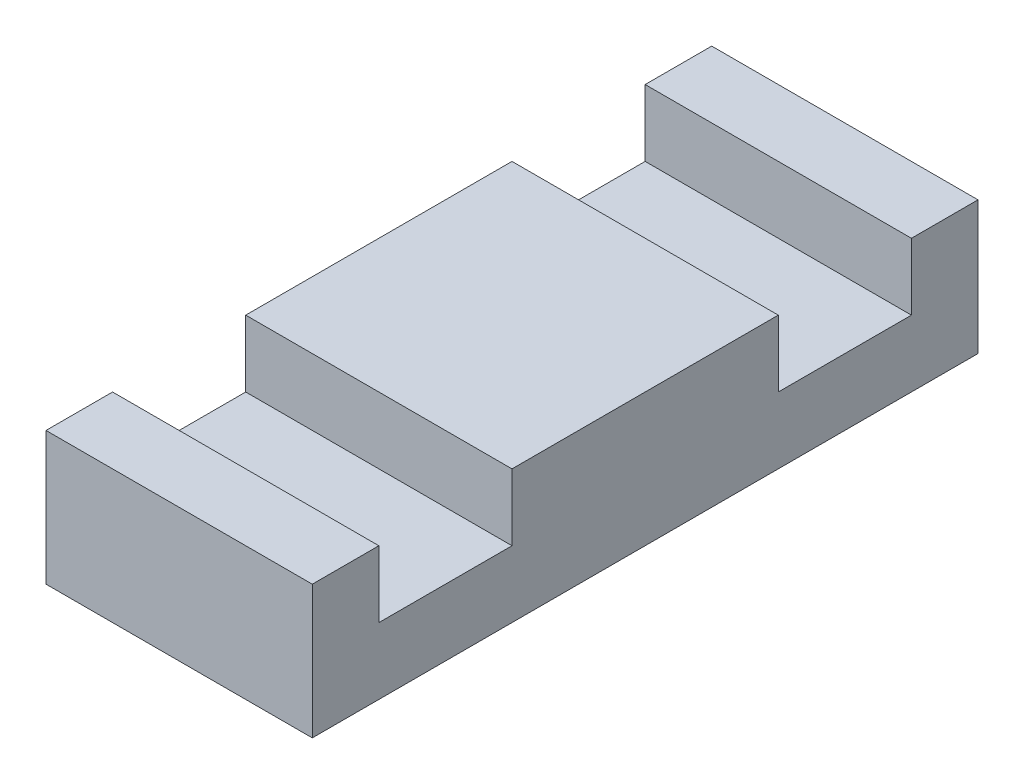
ISO-10303-21;
HEADER;
FILE_DESCRIPTION(('STEP AP214'),'2;1');
FILE_NAME('part.step','',(''),(''),'','','');
FILE_SCHEMA(('AUTOMOTIVE_DESIGN { 1 0 10303 214 1 1 1 1 }'));
ENDSEC;
DATA;
#1=APPLICATION_CONTEXT('core data for automotive mechanical design processes');
#2=APPLICATION_PROTOCOL_DEFINITION('international standard','automotive_design',2000,#1);
#3=PRODUCT_CONTEXT('',#1,'mechanical');
#4=PRODUCT('Part','Part','',(#3));
#5=PRODUCT_RELATED_PRODUCT_CATEGORY('part','',(#4));
#6=PRODUCT_DEFINITION_FORMATION('','',#4);
#7=PRODUCT_DEFINITION_CONTEXT('part definition',#1,'design');
#8=PRODUCT_DEFINITION('design','',#6,#7);
#9=PRODUCT_DEFINITION_SHAPE('','',#8);
#10=(LENGTH_UNIT() NAMED_UNIT(*) SI_UNIT(.MILLI.,.METRE.));
#11=(NAMED_UNIT(*) PLANE_ANGLE_UNIT() SI_UNIT($,.RADIAN.));
#12=(NAMED_UNIT(*) SI_UNIT($,.STERADIAN.) SOLID_ANGLE_UNIT());
#13=UNCERTAINTY_MEASURE_WITH_UNIT(LENGTH_MEASURE(1.E-05),#10,'distance_accuracy_value','');
#14=(GEOMETRIC_REPRESENTATION_CONTEXT(3) GLOBAL_UNCERTAINTY_ASSIGNED_CONTEXT((#13)) GLOBAL_UNIT_ASSIGNED_CONTEXT((#10,
#11,#12)) REPRESENTATION_CONTEXT('',''));
#15=CARTESIAN_POINT('',(0.,0.,0.));
#16=DIRECTION('',(0.,0.,1.));
#17=DIRECTION('',(1.,0.,0.));
#18=AXIS2_PLACEMENT_3D('',#15,#16,#17);
#19=CARTESIAN_POINT('',(0.,12.7,0.));
#20=DIRECTION('',(0.,-1.,0.));
#21=DIRECTION('',(0.,0.,-1.));
#22=AXIS2_PLACEMENT_3D('',#19,#20,#21);
#23=PLANE('',#22);
#24=DIRECTION('',(0.,0.,1.));
#25=VECTOR('',#24,1.);
#26=CARTESIAN_POINT('',(-12.7,12.7,31.75));
#27=LINE('',#26,#25);
#28=CARTESIAN_POINT('',(-12.7,12.7,-12.7));
#29=VERTEX_POINT('',#28);
#30=CARTESIAN_POINT('',(-12.7,12.7,12.7));
#31=VERTEX_POINT('',#30);
#32=EDGE_CURVE('E187',#29,#31,#27,.T.);
#33=ORIENTED_EDGE('',*,*,#32,.T.);
#34=DIRECTION('',(-1.,0.,0.));
#35=VECTOR('',#34,1.);
#36=CARTESIAN_POINT('',(-12.7,12.7,12.7));
#37=LINE('',#36,#35);
#38=CARTESIAN_POINT('',(12.7,12.7,12.7));
#39=VERTEX_POINT('',#38);
#40=EDGE_CURVE('E138',#39,#31,#37,.T.);
#41=ORIENTED_EDGE('',*,*,#40,.F.);
#42=DIRECTION('',(0.,0.,-1.));
#43=VECTOR('',#42,1.);
#44=CARTESIAN_POINT('',(12.7,12.7,31.75));
#45=LINE('',#44,#43);
#46=CARTESIAN_POINT('',(12.7,12.7,-12.7));
#47=VERTEX_POINT('',#46);
#48=EDGE_CURVE('E180',#39,#47,#45,.T.);
#49=ORIENTED_EDGE('',*,*,#48,.T.);
#50=DIRECTION('',(1.,0.,0.));
#51=VECTOR('',#50,1.);
#52=CARTESIAN_POINT('',(-12.7,12.7,-12.7));
#53=LINE('',#52,#51);
#54=EDGE_CURVE('E162',#29,#47,#53,.T.);
#55=ORIENTED_EDGE('',*,*,#54,.F.);
#56=EDGE_LOOP('',(#33,#41,#49,#55));
#57=FACE_BOUND('',#56,.T.);
#58=ADVANCED_FACE('F33',(#57),#23,.F.);
#59=CARTESIAN_POINT('',(-12.7,12.7,-31.75));
#60=VERTEX_POINT('',#59);
#61=CARTESIAN_POINT('',(-12.7,12.7,-25.4));
#62=VERTEX_POINT('',#61);
#63=EDGE_CURVE('E183',#60,#62,#27,.T.);
#64=ORIENTED_EDGE('',*,*,#63,.T.);
#65=DIRECTION('',(-1.,0.,0.));
#66=VECTOR('',#65,1.);
#67=CARTESIAN_POINT('',(-12.7,12.7,-25.4));
#68=LINE('',#67,#66);
#69=CARTESIAN_POINT('',(12.7,12.7,-25.4));
#70=VERTEX_POINT('',#69);
#71=EDGE_CURVE('E154',#70,#62,#68,.T.);
#72=ORIENTED_EDGE('',*,*,#71,.F.);
#73=CARTESIAN_POINT('',(12.7,12.7,-31.75));
#74=VERTEX_POINT('',#73);
#75=EDGE_CURVE('E181',#70,#74,#45,.T.);
#76=ORIENTED_EDGE('',*,*,#75,.T.);
#77=DIRECTION('',(-1.,0.,0.));
#78=VECTOR('',#77,1.);
#79=CARTESIAN_POINT('',(-12.7,12.7,-31.75));
#80=LINE('',#79,#78);
#81=EDGE_CURVE('E179',#74,#60,#80,.T.);
#82=ORIENTED_EDGE('',*,*,#81,.T.);
#83=EDGE_LOOP('',(#64,#72,#76,#82));
#84=FACE_BOUND('',#83,.T.);
#85=ADVANCED_FACE('F239',(#84),#23,.F.);
#86=CARTESIAN_POINT('',(12.7,12.7,31.75));
#87=DIRECTION('',(-1.,0.,0.));
#88=DIRECTION('',(0.,0.,1.));
#89=AXIS2_PLACEMENT_3D('',#86,#87,#88);
#90=PLANE('',#89);
#91=ORIENTED_EDGE('',*,*,#48,.F.);
#92=DIRECTION('',(0.,1.,0.));
#93=VECTOR('',#92,1.);
#94=CARTESIAN_POINT('',(12.7,6.35,12.7));
#95=LINE('',#94,#93);
#96=CARTESIAN_POINT('',(12.7,6.35,12.7));
#97=VERTEX_POINT('',#96);
#98=EDGE_CURVE('E145',#97,#39,#95,.T.);
#99=ORIENTED_EDGE('',*,*,#98,.F.);
#100=DIRECTION('',(0.,0.,-1.));
#101=VECTOR('',#100,1.);
#102=CARTESIAN_POINT('',(12.7,6.35,12.7));
#103=LINE('',#102,#101);
#104=CARTESIAN_POINT('',(12.7,6.35,25.4));
#105=VERTEX_POINT('',#104);
#106=EDGE_CURVE('E128',#105,#97,#103,.T.);
#107=ORIENTED_EDGE('',*,*,#106,.F.);
#108=DIRECTION('',(0.,1.,0.));
#109=VECTOR('',#108,1.);
#110=CARTESIAN_POINT('',(12.7,6.35,25.4));
#111=LINE('',#110,#109);
#112=CARTESIAN_POINT('',(12.7,12.7,25.4));
#113=VERTEX_POINT('',#112);
#114=EDGE_CURVE('E125',#105,#113,#111,.T.);
#115=ORIENTED_EDGE('',*,*,#114,.T.);
#116=CARTESIAN_POINT('',(12.7,12.7,31.75));
#117=VERTEX_POINT('',#116);
#118=EDGE_CURVE('E176',#117,#113,#45,.T.);
#119=ORIENTED_EDGE('',*,*,#118,.F.);
#120=DIRECTION('',(0.,-1.,0.));
#121=VECTOR('',#120,1.);
#122=CARTESIAN_POINT('',(12.7,12.7,31.75));
#123=LINE('',#122,#121);
#124=CARTESIAN_POINT('',(12.7,0.,31.75));
#125=VERTEX_POINT('',#124);
#126=EDGE_CURVE('E189',#117,#125,#123,.T.);
#127=ORIENTED_EDGE('',*,*,#126,.T.);
#128=DIRECTION('',(0.,0.,-1.));
#129=VECTOR('',#128,1.);
#130=CARTESIAN_POINT('',(12.7,0.,31.75));
#131=LINE('',#130,#129);
#132=CARTESIAN_POINT('',(12.7,0.,-31.75));
#133=VERTEX_POINT('',#132);
#134=EDGE_CURVE('E169',#125,#133,#131,.T.);
#135=ORIENTED_EDGE('',*,*,#134,.T.);
#136=DIRECTION('',(0.,-1.,0.));
#137=VECTOR('',#136,1.);
#138=CARTESIAN_POINT('',(12.7,12.7,-31.75));
#139=LINE('',#138,#137);
#140=EDGE_CURVE('E11',#74,#133,#139,.T.);
#141=ORIENTED_EDGE('',*,*,#140,.F.);
#142=ORIENTED_EDGE('',*,*,#75,.F.);
#143=DIRECTION('',(0.,1.,0.));
#144=VECTOR('',#143,1.);
#145=CARTESIAN_POINT('',(12.7,6.35,-25.4));
#146=LINE('',#145,#144);
#147=CARTESIAN_POINT('',(12.7,6.35,-25.4));
#148=VERTEX_POINT('',#147);
#149=EDGE_CURVE('E170',#148,#70,#146,.T.);
#150=ORIENTED_EDGE('',*,*,#149,.F.);
#151=DIRECTION('',(0.,0.,-1.));
#152=VECTOR('',#151,1.);
#153=CARTESIAN_POINT('',(12.7,6.35,-25.4));
#154=LINE('',#153,#152);
#155=CARTESIAN_POINT('',(12.7,6.35,-12.7));
#156=VERTEX_POINT('',#155);
#157=EDGE_CURVE('E157',#156,#148,#154,.T.);
#158=ORIENTED_EDGE('',*,*,#157,.F.);
#159=DIRECTION('',(0.,1.,0.));
#160=VECTOR('',#159,1.);
#161=CARTESIAN_POINT('',(12.7,6.35,-12.7));
#162=LINE('',#161,#160);
#163=EDGE_CURVE('E172',#156,#47,#162,.T.);
#164=ORIENTED_EDGE('',*,*,#163,.T.);
#165=EDGE_LOOP('',(#91,#99,#107,#115,#119,#127,#135,#141,#142,#150,#158,#164));
#166=FACE_BOUND('',#165,.T.);
#167=ADVANCED_FACE('F35',(#166),#90,.F.);
#168=CARTESIAN_POINT('',(-12.7,12.7,-31.75));
#169=DIRECTION('',(0.,0.,1.));
#170=DIRECTION('',(1.,0.,0.));
#171=AXIS2_PLACEMENT_3D('',#168,#169,#170);
#172=PLANE('',#171);
#173=DIRECTION('',(-1.,0.,0.));
#174=VECTOR('',#173,1.);
#175=CARTESIAN_POINT('',(-12.7,0.,-31.75));
#176=LINE('',#175,#174);
#177=CARTESIAN_POINT('',(-12.7,0.,-31.75));
#178=VERTEX_POINT('',#177);
#179=EDGE_CURVE('E192',#133,#178,#176,.T.);
#180=ORIENTED_EDGE('',*,*,#179,.T.);
#181=DIRECTION('',(0.,-1.,0.));
#182=VECTOR('',#181,1.);
#183=CARTESIAN_POINT('',(-12.7,12.7,-31.75));
#184=LINE('',#183,#182);
#185=EDGE_CURVE('E41',#60,#178,#184,.T.);
#186=ORIENTED_EDGE('',*,*,#185,.F.);
#187=ORIENTED_EDGE('',*,*,#81,.F.);
#188=ORIENTED_EDGE('',*,*,#140,.T.);
#189=EDGE_LOOP('',(#180,#186,#187,#188));
#190=FACE_BOUND('',#189,.T.);
#191=ADVANCED_FACE('F241',(#190),#172,.F.);
#192=CARTESIAN_POINT('',(-12.7,12.7,31.75));
#193=DIRECTION('',(1.,0.,0.));
#194=DIRECTION('',(0.,0.,-1.));
#195=AXIS2_PLACEMENT_3D('',#192,#193,#194);
#196=PLANE('',#195);
#197=DIRECTION('',(0.,0.,1.));
#198=VECTOR('',#197,1.);
#199=CARTESIAN_POINT('',(-12.7,6.35,12.7));
#200=LINE('',#199,#198);
#201=CARTESIAN_POINT('',(-12.7,6.35,12.7));
#202=VERTEX_POINT('',#201);
#203=CARTESIAN_POINT('',(-12.7,6.35,25.4));
#204=VERTEX_POINT('',#203);
#205=EDGE_CURVE('E129',#202,#204,#200,.T.);
#206=ORIENTED_EDGE('',*,*,#205,.F.);
#207=DIRECTION('',(0.,1.,0.));
#208=VECTOR('',#207,1.);
#209=CARTESIAN_POINT('',(-12.7,6.35,12.7));
#210=LINE('',#209,#208);
#211=EDGE_CURVE('E164',#202,#31,#210,.T.);
#212=ORIENTED_EDGE('',*,*,#211,.T.);
#213=ORIENTED_EDGE('',*,*,#32,.F.);
#214=DIRECTION('',(0.,1.,0.));
#215=VECTOR('',#214,1.);
#216=CARTESIAN_POINT('',(-12.7,6.35,-12.7));
#217=LINE('',#216,#215);
#218=CARTESIAN_POINT('',(-12.7,6.35,-12.7));
#219=VERTEX_POINT('',#218);
#220=EDGE_CURVE('E56',#219,#29,#217,.T.);
#221=ORIENTED_EDGE('',*,*,#220,.F.);
#222=DIRECTION('',(0.,0.,1.));
#223=VECTOR('',#222,1.);
#224=CARTESIAN_POINT('',(-12.7,6.35,-25.4));
#225=LINE('',#224,#223);
#226=CARTESIAN_POINT('',(-12.7,6.35,-25.4));
#227=VERTEX_POINT('',#226);
#228=EDGE_CURVE('E150',#227,#219,#225,.T.);
#229=ORIENTED_EDGE('',*,*,#228,.F.);
#230=DIRECTION('',(0.,1.,0.));
#231=VECTOR('',#230,1.);
#232=CARTESIAN_POINT('',(-12.7,6.35,-25.4));
#233=LINE('',#232,#231);
#234=EDGE_CURVE('E166',#227,#62,#233,.T.);
#235=ORIENTED_EDGE('',*,*,#234,.T.);
#236=ORIENTED_EDGE('',*,*,#63,.F.);
#237=ORIENTED_EDGE('',*,*,#185,.T.);
#238=DIRECTION('',(0.,0.,1.));
#239=VECTOR('',#238,1.);
#240=CARTESIAN_POINT('',(-12.7,0.,31.75));
#241=LINE('',#240,#239);
#242=CARTESIAN_POINT('',(-12.7,0.,31.75));
#243=VERTEX_POINT('',#242);
#244=EDGE_CURVE('E194',#178,#243,#241,.T.);
#245=ORIENTED_EDGE('',*,*,#244,.T.);
#246=DIRECTION('',(0.,-1.,0.));
#247=VECTOR('',#246,1.);
#248=CARTESIAN_POINT('',(-12.7,12.7,31.75));
#249=LINE('',#248,#247);
#250=CARTESIAN_POINT('',(-12.7,12.7,31.75));
#251=VERTEX_POINT('',#250);
#252=EDGE_CURVE('E200',#251,#243,#249,.T.);
#253=ORIENTED_EDGE('',*,*,#252,.F.);
#254=CARTESIAN_POINT('',(-12.7,12.7,25.4));
#255=VERTEX_POINT('',#254);
#256=EDGE_CURVE('E143',#255,#251,#27,.T.);
#257=ORIENTED_EDGE('',*,*,#256,.F.);
#258=DIRECTION('',(0.,1.,0.));
#259=VECTOR('',#258,1.);
#260=CARTESIAN_POINT('',(-12.7,6.35,25.4));
#261=LINE('',#260,#259);
#262=EDGE_CURVE('E48',#204,#255,#261,.T.);
#263=ORIENTED_EDGE('',*,*,#262,.F.);
#264=EDGE_LOOP('',(#206,#212,#213,#221,#229,#235,#236,#237,#245,#253,#257,#263));
#265=FACE_BOUND('',#264,.T.);
#266=ADVANCED_FACE('F141',(#265),#196,.F.);
#267=CARTESIAN_POINT('',(-12.7,12.7,31.75));
#268=DIRECTION('',(0.,0.,-1.));
#269=DIRECTION('',(-1.,0.,0.));
#270=AXIS2_PLACEMENT_3D('',#267,#268,#269);
#271=PLANE('',#270);
#272=DIRECTION('',(1.,0.,0.));
#273=VECTOR('',#272,1.);
#274=CARTESIAN_POINT('',(-12.7,0.,31.75));
#275=LINE('',#274,#273);
#276=EDGE_CURVE('E196',#243,#125,#275,.T.);
#277=ORIENTED_EDGE('',*,*,#276,.T.);
#278=ORIENTED_EDGE('',*,*,#126,.F.);
#279=DIRECTION('',(1.,0.,0.));
#280=VECTOR('',#279,1.);
#281=CARTESIAN_POINT('',(-12.7,12.7,31.75));
#282=LINE('',#281,#280);
#283=EDGE_CURVE('E186',#251,#117,#282,.T.);
#284=ORIENTED_EDGE('',*,*,#283,.F.);
#285=ORIENTED_EDGE('',*,*,#252,.T.);
#286=EDGE_LOOP('',(#277,#278,#284,#285));
#287=FACE_BOUND('',#286,.T.);
#288=ADVANCED_FACE('F214',(#287),#271,.F.);
#289=ORIENTED_EDGE('',*,*,#118,.T.);
#290=DIRECTION('',(1.,0.,0.));
#291=VECTOR('',#290,1.);
#292=CARTESIAN_POINT('',(-12.7,12.7,25.4));
#293=LINE('',#292,#291);
#294=EDGE_CURVE('E222',#255,#113,#293,.T.);
#295=ORIENTED_EDGE('',*,*,#294,.F.);
#296=ORIENTED_EDGE('',*,*,#256,.T.);
#297=ORIENTED_EDGE('',*,*,#283,.T.);
#298=EDGE_LOOP('',(#289,#295,#296,#297));
#299=FACE_BOUND('',#298,.T.);
#300=ADVANCED_FACE('F221',(#299),#23,.F.);
#301=CARTESIAN_POINT('',(0.,0.,0.));
#302=DIRECTION('',(0.,-1.,0.));
#303=DIRECTION('',(0.,0.,-1.));
#304=AXIS2_PLACEMENT_3D('',#301,#302,#303);
#305=PLANE('',#304);
#306=ORIENTED_EDGE('',*,*,#134,.F.);
#307=ORIENTED_EDGE('',*,*,#276,.F.);
#308=ORIENTED_EDGE('',*,*,#244,.F.);
#309=ORIENTED_EDGE('',*,*,#179,.F.);
#310=EDGE_LOOP('',(#306,#307,#308,#309));
#311=FACE_BOUND('',#310,.T.);
#312=ADVANCED_FACE('F211',(#311),#305,.T.);
#313=CARTESIAN_POINT('',(-12.7,6.35,-25.4));
#314=DIRECTION('',(0.,0.,-1.));
#315=DIRECTION('',(-1.,0.,0.));
#316=AXIS2_PLACEMENT_3D('',#313,#314,#315);
#317=PLANE('',#316);
#318=ORIENTED_EDGE('',*,*,#71,.T.);
#319=ORIENTED_EDGE('',*,*,#234,.F.);
#320=DIRECTION('',(-1.,0.,0.));
#321=VECTOR('',#320,1.);
#322=CARTESIAN_POINT('',(-12.7,6.35,-25.4));
#323=LINE('',#322,#321);
#324=EDGE_CURVE('E159',#148,#227,#323,.T.);
#325=ORIENTED_EDGE('',*,*,#324,.F.);
#326=ORIENTED_EDGE('',*,*,#149,.T.);
#327=EDGE_LOOP('',(#318,#319,#325,#326));
#328=FACE_BOUND('',#327,.T.);
#329=ADVANCED_FACE('F260',(#328),#317,.F.);
#330=CARTESIAN_POINT('',(-12.7,6.35,-12.7));
#331=DIRECTION('',(0.,0.,1.));
#332=DIRECTION('',(1.,0.,0.));
#333=AXIS2_PLACEMENT_3D('',#330,#331,#332);
#334=PLANE('',#333);
#335=ORIENTED_EDGE('',*,*,#54,.T.);
#336=ORIENTED_EDGE('',*,*,#163,.F.);
#337=DIRECTION('',(1.,0.,0.));
#338=VECTOR('',#337,1.);
#339=CARTESIAN_POINT('',(-12.7,6.35,-12.7));
#340=LINE('',#339,#338);
#341=EDGE_CURVE('E153',#219,#156,#340,.T.);
#342=ORIENTED_EDGE('',*,*,#341,.F.);
#343=ORIENTED_EDGE('',*,*,#220,.T.);
#344=EDGE_LOOP('',(#335,#336,#342,#343));
#345=FACE_BOUND('',#344,.T.);
#346=ADVANCED_FACE('F288',(#345),#334,.F.);
#347=CARTESIAN_POINT('',(0.,6.35,0.));
#348=DIRECTION('',(0.,1.,0.));
#349=DIRECTION('',(0.,0.,1.));
#350=AXIS2_PLACEMENT_3D('',#347,#348,#349);
#351=PLANE('',#350);
#352=ORIENTED_EDGE('',*,*,#228,.T.);
#353=ORIENTED_EDGE('',*,*,#341,.T.);
#354=ORIENTED_EDGE('',*,*,#157,.T.);
#355=ORIENTED_EDGE('',*,*,#324,.T.);
#356=EDGE_LOOP('',(#352,#353,#354,#355));
#357=FACE_BOUND('',#356,.T.);
#358=ADVANCED_FACE('F299',(#357),#351,.T.);
#359=CARTESIAN_POINT('',(-12.7,6.35,12.7));
#360=DIRECTION('',(0.,0.,-1.));
#361=DIRECTION('',(-1.,0.,0.));
#362=AXIS2_PLACEMENT_3D('',#359,#360,#361);
#363=PLANE('',#362);
#364=ORIENTED_EDGE('',*,*,#40,.T.);
#365=ORIENTED_EDGE('',*,*,#211,.F.);
#366=DIRECTION('',(-1.,0.,0.));
#367=VECTOR('',#366,1.);
#368=CARTESIAN_POINT('',(-12.7,6.35,12.7));
#369=LINE('',#368,#367);
#370=EDGE_CURVE('E135',#97,#202,#369,.T.);
#371=ORIENTED_EDGE('',*,*,#370,.F.);
#372=ORIENTED_EDGE('',*,*,#98,.T.);
#373=EDGE_LOOP('',(#364,#365,#371,#372));
#374=FACE_BOUND('',#373,.T.);
#375=ADVANCED_FACE('F234',(#374),#363,.F.);
#376=CARTESIAN_POINT('',(-12.7,6.35,25.4));
#377=DIRECTION('',(0.,0.,1.));
#378=DIRECTION('',(1.,0.,0.));
#379=AXIS2_PLACEMENT_3D('',#376,#377,#378);
#380=PLANE('',#379);
#381=ORIENTED_EDGE('',*,*,#294,.T.);
#382=ORIENTED_EDGE('',*,*,#114,.F.);
#383=DIRECTION('',(1.,0.,0.));
#384=VECTOR('',#383,1.);
#385=CARTESIAN_POINT('',(-12.7,6.35,25.4));
#386=LINE('',#385,#384);
#387=EDGE_CURVE('E121',#204,#105,#386,.T.);
#388=ORIENTED_EDGE('',*,*,#387,.F.);
#389=ORIENTED_EDGE('',*,*,#262,.T.);
#390=EDGE_LOOP('',(#381,#382,#388,#389));
#391=FACE_BOUND('',#390,.T.);
#392=ADVANCED_FACE('F123',(#391),#380,.F.);
#393=CARTESIAN_POINT('',(0.,6.35,0.));
#394=DIRECTION('',(0.,1.,0.));
#395=DIRECTION('',(0.,0.,1.));
#396=AXIS2_PLACEMENT_3D('',#393,#394,#395);
#397=PLANE('',#396);
#398=ORIENTED_EDGE('',*,*,#205,.T.);
#399=ORIENTED_EDGE('',*,*,#387,.T.);
#400=ORIENTED_EDGE('',*,*,#106,.T.);
#401=ORIENTED_EDGE('',*,*,#370,.T.);
#402=EDGE_LOOP('',(#398,#399,#400,#401));
#403=FACE_BOUND('',#402,.T.);
#404=ADVANCED_FACE('F133',(#403),#397,.T.);
#405=CLOSED_SHELL('',(#58,#85,#167,#191,#266,#288,#300,#312,#329,#346,#358,#375,#392,#404));
#406=MANIFOLD_SOLID_BREP('B2',#405);
#407=ADVANCED_BREP_SHAPE_REPRESENTATION('',(#18,#406),#14);
#408=SHAPE_DEFINITION_REPRESENTATION(#9,#407);
ENDSEC;
END-ISO-10303-21;
